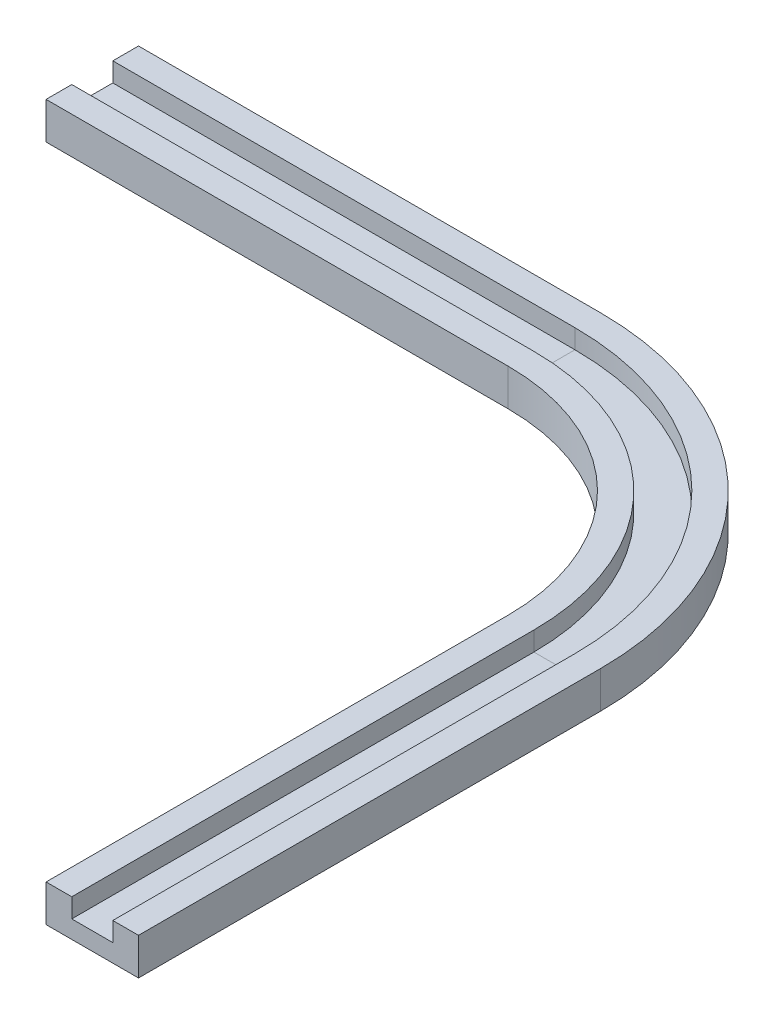
ISO-10303-21;
HEADER;
FILE_DESCRIPTION(('STEP AP214'),'2;1');
FILE_NAME('part.step','',(''),(''),'','','');
FILE_SCHEMA(('AUTOMOTIVE_DESIGN { 1 0 10303 214 1 1 1 1 }'));
ENDSEC;
DATA;
#1=APPLICATION_CONTEXT('core data for automotive mechanical design processes');
#2=APPLICATION_PROTOCOL_DEFINITION('international standard','automotive_design',2000,#1);
#3=PRODUCT_CONTEXT('',#1,'mechanical');
#4=PRODUCT('Part','Part','',(#3));
#5=PRODUCT_RELATED_PRODUCT_CATEGORY('part','',(#4));
#6=PRODUCT_DEFINITION_FORMATION('','',#4);
#7=PRODUCT_DEFINITION_CONTEXT('part definition',#1,'design');
#8=PRODUCT_DEFINITION('design','',#6,#7);
#9=PRODUCT_DEFINITION_SHAPE('','',#8);
#10=(LENGTH_UNIT() NAMED_UNIT(*) SI_UNIT(.MILLI.,.METRE.));
#11=(NAMED_UNIT(*) PLANE_ANGLE_UNIT() SI_UNIT($,.RADIAN.));
#12=(NAMED_UNIT(*) SI_UNIT($,.STERADIAN.) SOLID_ANGLE_UNIT());
#13=UNCERTAINTY_MEASURE_WITH_UNIT(LENGTH_MEASURE(1.E-05),#10,'distance_accuracy_value','');
#14=(GEOMETRIC_REPRESENTATION_CONTEXT(3) GLOBAL_UNCERTAINTY_ASSIGNED_CONTEXT((#13)) GLOBAL_UNIT_ASSIGNED_CONTEXT((#10,
#11,#12)) REPRESENTATION_CONTEXT('',''));
#15=CARTESIAN_POINT('',(0.,0.,0.));
#16=DIRECTION('',(0.,0.,1.));
#17=DIRECTION('',(1.,0.,0.));
#18=AXIS2_PLACEMENT_3D('',#15,#16,#17);
#19=CARTESIAN_POINT('',(-63.1485077421373,8.,-16.7186331560444));
#20=DIRECTION('',(-1.,0.,0.));
#21=DIRECTION('',(0.,0.,1.));
#22=AXIS2_PLACEMENT_3D('',#19,#20,#21);
#23=PLANE('',#22);
#24=DIRECTION('',(0.,0.,1.));
#25=VECTOR('',#24,1.);
#26=CARTESIAN_POINT('',(-63.1485077421373,3.85429480176,-31.1581497267418));
#27=LINE('',#26,#25);
#28=CARTESIAN_POINT('',(-63.1485077421373,3.85429480176,-31.1581497267418));
#29=VERTEX_POINT('',#28);
#30=CARTESIAN_POINT('',(-63.1485077421373,3.85429480176,-22.279116585348));
#31=VERTEX_POINT('',#30);
#32=EDGE_CURVE('E262',#29,#31,#27,.T.);
#33=ORIENTED_EDGE('',*,*,#32,.F.);
#34=DIRECTION('',(0.,-1.,0.));
#35=VECTOR('',#34,1.);
#36=CARTESIAN_POINT('',(-63.1485077421373,8.,-31.1581497267418));
#37=LINE('',#36,#35);
#38=CARTESIAN_POINT('',(-63.1485077421373,8.,-31.1581497267418));
#39=VERTEX_POINT('',#38);
#40=EDGE_CURVE('E266',#39,#29,#37,.T.);
#41=ORIENTED_EDGE('',*,*,#40,.F.);
#42=DIRECTION('',(0.,0.,-1.));
#43=VECTOR('',#42,1.);
#44=CARTESIAN_POINT('',(-63.1485077421373,8.,-16.7186331560444));
#45=LINE('',#44,#43);
#46=CARTESIAN_POINT('',(-63.1485077421373,8.,-36.7186331560443));
#47=VERTEX_POINT('',#46);
#48=EDGE_CURVE('E96',#39,#47,#45,.T.);
#49=ORIENTED_EDGE('',*,*,#48,.T.);
#50=DIRECTION('',(0.,-1.,0.));
#51=VECTOR('',#50,1.);
#52=CARTESIAN_POINT('',(-63.1485077421373,8.,-36.7186331560443));
#53=LINE('',#52,#51);
#54=CARTESIAN_POINT('',(-63.1485077421373,0.,-36.7186331560443));
#55=VERTEX_POINT('',#54);
#56=EDGE_CURVE('E39',#47,#55,#53,.T.);
#57=ORIENTED_EDGE('',*,*,#56,.T.);
#58=DIRECTION('',(0.,0.,-1.));
#59=VECTOR('',#58,1.);
#60=CARTESIAN_POINT('',(-63.1485077421373,0.,-16.7186331560444));
#61=LINE('',#60,#59);
#62=CARTESIAN_POINT('',(-63.1485077421373,0.,-16.7186331560444));
#63=VERTEX_POINT('',#62);
#64=EDGE_CURVE('E149',#63,#55,#61,.T.);
#65=ORIENTED_EDGE('',*,*,#64,.F.);
#66=DIRECTION('',(0.,-1.,0.));
#67=VECTOR('',#66,1.);
#68=CARTESIAN_POINT('',(-63.1485077421373,8.,-16.7186331560444));
#69=LINE('',#68,#67);
#70=CARTESIAN_POINT('',(-63.1485077421373,8.,-16.7186331560444));
#71=VERTEX_POINT('',#70);
#72=EDGE_CURVE('E11',#71,#63,#69,.T.);
#73=ORIENTED_EDGE('',*,*,#72,.F.);
#74=CARTESIAN_POINT('',(-63.1485077421373,8.,-22.279116585348));
#75=VERTEX_POINT('',#74);
#76=EDGE_CURVE('E187',#71,#75,#45,.T.);
#77=ORIENTED_EDGE('',*,*,#76,.T.);
#78=DIRECTION('',(0.,1.,0.));
#79=VECTOR('',#78,1.);
#80=CARTESIAN_POINT('',(-63.1485077421373,8.,-22.279116585348));
#81=LINE('',#80,#79);
#82=EDGE_CURVE('E257',#31,#75,#81,.T.);
#83=ORIENTED_EDGE('',*,*,#82,.F.);
#84=EDGE_LOOP('',(#33,#41,#49,#57,#65,#73,#77,#83));
#85=FACE_BOUND('',#84,.T.);
#86=ADVANCED_FACE('F36',(#85),#23,.T.);
#87=CARTESIAN_POINT('',(103.499598757599,8.,129.929492268602));
#88=DIRECTION('',(0.,0.,1.));
#89=DIRECTION('',(1.,0.,0.));
#90=AXIS2_PLACEMENT_3D('',#87,#88,#89);
#91=PLANE('',#90);
#92=DIRECTION('',(-1.,0.,0.));
#93=VECTOR('',#92,1.);
#94=CARTESIAN_POINT('',(103.499598757599,8.,129.929492268602));
#95=LINE('',#94,#93);
#96=CARTESIAN_POINT('',(103.499598757599,8.,129.929492268602));
#97=VERTEX_POINT('',#96);
#98=CARTESIAN_POINT('',(97.9391153282953,8.,129.929492268602));
#99=VERTEX_POINT('',#98);
#100=EDGE_CURVE('E141',#97,#99,#95,.T.);
#101=ORIENTED_EDGE('',*,*,#100,.T.);
#102=DIRECTION('',(0.,1.,0.));
#103=VECTOR('',#102,1.);
#104=CARTESIAN_POINT('',(97.9391153282953,8.,129.929492268602));
#105=LINE('',#104,#103);
#106=CARTESIAN_POINT('',(97.9391153282953,3.85429480176,129.929492268602));
#107=VERTEX_POINT('',#106);
#108=EDGE_CURVE('E264',#107,#99,#105,.T.);
#109=ORIENTED_EDGE('',*,*,#108,.F.);
#110=DIRECTION('',(1.,0.,0.));
#111=VECTOR('',#110,1.);
#112=CARTESIAN_POINT('',(97.9391153282954,3.85429480176,129.929492268602));
#113=LINE('',#112,#111);
#114=CARTESIAN_POINT('',(89.0600821869015,3.85429480176,129.929492268602));
#115=VERTEX_POINT('',#114);
#116=EDGE_CURVE('E261',#115,#107,#113,.T.);
#117=ORIENTED_EDGE('',*,*,#116,.F.);
#118=DIRECTION('',(0.,-1.,0.));
#119=VECTOR('',#118,1.);
#120=CARTESIAN_POINT('',(89.0600821869015,8.,129.929492268602));
#121=LINE('',#120,#119);
#122=CARTESIAN_POINT('',(89.0600821869015,8.,129.929492268602));
#123=VERTEX_POINT('',#122);
#124=EDGE_CURVE('E153',#123,#115,#121,.T.);
#125=ORIENTED_EDGE('',*,*,#124,.F.);
#126=CARTESIAN_POINT('',(83.4995987575986,8.,129.929492268602));
#127=VERTEX_POINT('',#126);
#128=EDGE_CURVE('E144',#123,#127,#95,.T.);
#129=ORIENTED_EDGE('',*,*,#128,.T.);
#130=DIRECTION('',(0.,-1.,0.));
#131=VECTOR('',#130,1.);
#132=CARTESIAN_POINT('',(83.4995987575986,8.,129.929492268602));
#133=LINE('',#132,#131);
#134=CARTESIAN_POINT('',(83.4995987575986,0.,129.929492268602));
#135=VERTEX_POINT('',#134);
#136=EDGE_CURVE('E138',#127,#135,#133,.T.);
#137=ORIENTED_EDGE('',*,*,#136,.T.);
#138=DIRECTION('',(-1.,0.,0.));
#139=VECTOR('',#138,1.);
#140=CARTESIAN_POINT('',(103.499598757599,0.,129.929492268602));
#141=LINE('',#140,#139);
#142=CARTESIAN_POINT('',(103.499598757599,0.,129.929492268602));
#143=VERTEX_POINT('',#142);
#144=EDGE_CURVE('E162',#143,#135,#141,.T.);
#145=ORIENTED_EDGE('',*,*,#144,.F.);
#146=DIRECTION('',(0.,-1.,0.));
#147=VECTOR('',#146,1.);
#148=CARTESIAN_POINT('',(103.499598757599,8.,129.929492268602));
#149=LINE('',#148,#147);
#150=EDGE_CURVE('E172',#97,#143,#149,.T.);
#151=ORIENTED_EDGE('',*,*,#150,.F.);
#152=EDGE_LOOP('',(#101,#109,#117,#125,#129,#137,#145,#151));
#153=FACE_BOUND('',#152,.T.);
#154=ADVANCED_FACE('F207',(#153),#91,.T.);
#155=CARTESIAN_POINT('',(36.8514922578627,8.,29.9294733436931));
#156=DIRECTION('',(0.,-1.,0.));
#157=DIRECTION('',(0.,0.,-1.));
#158=AXIS2_PLACEMENT_3D('',#155,#156,#157);
#159=PLANE('',#158);
#160=DIRECTION('',(0.,0.,1.));
#161=VECTOR('',#160,1.);
#162=CARTESIAN_POINT('',(97.9391153282954,8.,29.9294894290754));
#163=LINE('',#162,#161);
#164=CARTESIAN_POINT('',(97.9391153282954,8.,29.9294900593818));
#165=VERTEX_POINT('',#164);
#166=EDGE_CURVE('E197',#165,#99,#163,.T.);
#167=ORIENTED_EDGE('',*,*,#166,.T.);
#168=ORIENTED_EDGE('',*,*,#100,.F.);
#169=DIRECTION('',(0.,0.,1.));
#170=VECTOR('',#169,1.);
#171=CARTESIAN_POINT('',(103.499598757599,8.,29.9294922686023));
#172=LINE('',#171,#170);
#173=CARTESIAN_POINT('',(103.499598757599,8.,29.9294922686023));
#174=VERTEX_POINT('',#173);
#175=EDGE_CURVE('E201',#174,#97,#172,.T.);
#176=ORIENTED_EDGE('',*,*,#175,.F.);
#177=CARTESIAN_POINT('',(36.8514922578627,8.,29.9294733436931));
#178=DIRECTION('',(0.,-1.,0.));
#179=DIRECTION('',(0.,0.,-1.));
#180=AXIS2_PLACEMENT_3D('',#177,#178,#179);
#181=CIRCLE('',#180,66.648106499738);
#182=CARTESIAN_POINT('',(36.8514922578627,8.,-36.7186331560449));
#183=VERTEX_POINT('',#182);
#184=EDGE_CURVE('E194',#183,#174,#181,.T.);
#185=ORIENTED_EDGE('',*,*,#184,.F.);
#186=DIRECTION('',(1.,0.,0.));
#187=VECTOR('',#186,1.);
#188=CARTESIAN_POINT('',(-63.1485077421373,8.,-36.7186331560443));
#189=LINE('',#188,#187);
#190=EDGE_CURVE('E192',#47,#183,#189,.T.);
#191=ORIENTED_EDGE('',*,*,#190,.F.);
#192=ORIENTED_EDGE('',*,*,#48,.F.);
#193=DIRECTION('',(1.,0.,0.));
#194=VECTOR('',#193,1.);
#195=CARTESIAN_POINT('',(-64.1485077421373,8.,-31.1581497267418));
#196=LINE('',#195,#194);
#197=CARTESIAN_POINT('',(36.8514922578627,8.,-31.1581497267418));
#198=VERTEX_POINT('',#197);
#199=EDGE_CURVE('E274',#39,#198,#196,.T.);
#200=ORIENTED_EDGE('',*,*,#199,.T.);
#201=CARTESIAN_POINT('',(36.8514922578627,8.,29.9294733436931));
#202=DIRECTION('',(0.,-1.,0.));
#203=DIRECTION('',(0.,0.,-1.));
#204=AXIS2_PLACEMENT_3D('',#201,#202,#203);
#205=CIRCLE('',#204,61.087623070435);
#206=EDGE_CURVE('E278',#198,#165,#205,.T.);
#207=ORIENTED_EDGE('',*,*,#206,.T.);
#208=EDGE_LOOP('',(#167,#168,#176,#185,#191,#192,#200,#207));
#209=FACE_BOUND('',#208,.T.);
#210=ADVANCED_FACE('F306',(#209),#159,.F.);
#211=DIRECTION('',(0.,0.,1.));
#212=VECTOR('',#211,1.);
#213=CARTESIAN_POINT('',(89.0600821869016,8.,29.9294894290754));
#214=LINE('',#213,#212);
#215=CARTESIAN_POINT('',(89.0600821869017,8.,29.9294887987691));
#216=VERTEX_POINT('',#215);
#217=EDGE_CURVE('E213',#216,#123,#214,.T.);
#218=ORIENTED_EDGE('',*,*,#217,.F.);
#219=CARTESIAN_POINT('',(36.8514922578627,8.,29.9294733436931));
#220=DIRECTION('',(0.,-1.,0.));
#221=DIRECTION('',(0.,0.,-1.));
#222=AXIS2_PLACEMENT_3D('',#219,#220,#221);
#223=CIRCLE('',#222,52.2085899290412);
#224=CARTESIAN_POINT('',(36.8514922578627,8.,-22.2791165853481));
#225=VERTEX_POINT('',#224);
#226=EDGE_CURVE('E294',#225,#216,#223,.T.);
#227=ORIENTED_EDGE('',*,*,#226,.F.);
#228=DIRECTION('',(1.,0.,0.));
#229=VECTOR('',#228,1.);
#230=CARTESIAN_POINT('',(-64.1485077421373,8.,-22.279116585348));
#231=LINE('',#230,#229);
#232=EDGE_CURVE('E190',#75,#225,#231,.T.);
#233=ORIENTED_EDGE('',*,*,#232,.F.);
#234=ORIENTED_EDGE('',*,*,#76,.F.);
#235=DIRECTION('',(1.,0.,0.));
#236=VECTOR('',#235,1.);
#237=CARTESIAN_POINT('',(-63.1485077421373,8.,-16.7186331560444));
#238=LINE('',#237,#236);
#239=CARTESIAN_POINT('',(36.8514922578627,8.,-16.7186331560444));
#240=VERTEX_POINT('',#239);
#241=EDGE_CURVE('E125',#71,#240,#238,.T.);
#242=ORIENTED_EDGE('',*,*,#241,.T.);
#243=CARTESIAN_POINT('',(36.8514922578627,8.,29.9294733436931));
#244=DIRECTION('',(0.,-1.,0.));
#245=DIRECTION('',(0.,0.,-1.));
#246=AXIS2_PLACEMENT_3D('',#243,#244,#245);
#247=CIRCLE('',#246,46.6481064997376);
#248=CARTESIAN_POINT('',(83.4995987575984,8.,29.9294865895485));
#249=VERTEX_POINT('',#248);
#250=EDGE_CURVE('E116',#240,#249,#247,.T.);
#251=ORIENTED_EDGE('',*,*,#250,.T.);
#252=DIRECTION('',(0.,0.,1.));
#253=VECTOR('',#252,1.);
#254=CARTESIAN_POINT('',(83.4995987575986,8.,29.9294865895485));
#255=LINE('',#254,#253);
#256=EDGE_CURVE('E122',#249,#127,#255,.T.);
#257=ORIENTED_EDGE('',*,*,#256,.T.);
#258=ORIENTED_EDGE('',*,*,#128,.F.);
#259=EDGE_LOOP('',(#218,#227,#233,#234,#242,#251,#257,#258));
#260=FACE_BOUND('',#259,.T.);
#261=ADVANCED_FACE('F119',(#260),#159,.F.);
#262=CARTESIAN_POINT('',(-63.1485077421373,8.,-16.7186331560444));
#263=DIRECTION('',(0.,0.,-1.));
#264=DIRECTION('',(-1.,0.,0.));
#265=AXIS2_PLACEMENT_3D('',#262,#263,#264);
#266=PLANE('',#265);
#267=DIRECTION('',(1.,0.,0.));
#268=VECTOR('',#267,1.);
#269=CARTESIAN_POINT('',(-63.1485077421373,0.,-16.7186331560444));
#270=LINE('',#269,#268);
#271=CARTESIAN_POINT('',(36.8514922578627,0.,-16.7186331560444));
#272=VERTEX_POINT('',#271);
#273=EDGE_CURVE('E168',#63,#272,#270,.T.);
#274=ORIENTED_EDGE('',*,*,#273,.T.);
#275=DIRECTION('',(0.,-1.,0.));
#276=VECTOR('',#275,1.);
#277=CARTESIAN_POINT('',(36.8514922578627,8.,-16.7186331560444));
#278=LINE('',#277,#276);
#279=EDGE_CURVE('E44',#240,#272,#278,.T.);
#280=ORIENTED_EDGE('',*,*,#279,.F.);
#281=ORIENTED_EDGE('',*,*,#241,.F.);
#282=ORIENTED_EDGE('',*,*,#72,.T.);
#283=EDGE_LOOP('',(#274,#280,#281,#282));
#284=FACE_BOUND('',#283,.T.);
#285=ADVANCED_FACE('F185',(#284),#266,.F.);
#286=CARTESIAN_POINT('',(36.8514922578627,8.,29.9294733436931));
#287=DIRECTION('',(0.,-1.,0.));
#288=DIRECTION('',(0.,0.,-1.));
#289=AXIS2_PLACEMENT_3D('',#286,#287,#288);
#290=CYLINDRICAL_SURFACE('',#289,46.6481064997376);
#291=CARTESIAN_POINT('',(36.8514922578627,0.,29.9294733436931));
#292=DIRECTION('',(0.,-1.,0.));
#293=DIRECTION('',(0.,0.,-1.));
#294=AXIS2_PLACEMENT_3D('',#291,#292,#293);
#295=CIRCLE('',#294,46.6481064997376);
#296=CARTESIAN_POINT('',(83.4995987575984,0.,29.9294865895485));
#297=VERTEX_POINT('',#296);
#298=EDGE_CURVE('E134',#272,#297,#295,.T.);
#299=ORIENTED_EDGE('',*,*,#298,.T.);
#300=DIRECTION('',(0.,-1.,0.));
#301=VECTOR('',#300,1.);
#302=CARTESIAN_POINT('',(83.4995987575984,8.,29.9294865895485));
#303=LINE('',#302,#301);
#304=EDGE_CURVE('E131',#249,#297,#303,.T.);
#305=ORIENTED_EDGE('',*,*,#304,.F.);
#306=ORIENTED_EDGE('',*,*,#250,.F.);
#307=ORIENTED_EDGE('',*,*,#279,.T.);
#308=EDGE_LOOP('',(#299,#305,#306,#307));
#309=FACE_BOUND('',#308,.T.);
#310=ADVANCED_FACE('F132',(#309),#290,.F.);
#311=CARTESIAN_POINT('',(83.4995987575986,8.,29.9294865895485));
#312=DIRECTION('',(1.,0.,0.));
#313=DIRECTION('',(0.,0.,-1.));
#314=AXIS2_PLACEMENT_3D('',#311,#312,#313);
#315=PLANE('',#314);
#316=DIRECTION('',(0.,0.,1.));
#317=VECTOR('',#316,1.);
#318=CARTESIAN_POINT('',(83.4995987575986,0.,29.9294865895485));
#319=LINE('',#318,#317);
#320=EDGE_CURVE('E165',#297,#135,#319,.T.);
#321=ORIENTED_EDGE('',*,*,#320,.T.);
#322=ORIENTED_EDGE('',*,*,#136,.F.);
#323=ORIENTED_EDGE('',*,*,#256,.F.);
#324=ORIENTED_EDGE('',*,*,#304,.T.);
#325=EDGE_LOOP('',(#321,#322,#323,#324));
#326=FACE_BOUND('',#325,.T.);
#327=ADVANCED_FACE('F140',(#326),#315,.F.);
#328=CARTESIAN_POINT('',(103.499598757599,8.,29.9294922686023));
#329=DIRECTION('',(1.,0.,0.));
#330=DIRECTION('',(0.,0.,-1.));
#331=AXIS2_PLACEMENT_3D('',#328,#329,#330);
#332=PLANE('',#331);
#333=DIRECTION('',(0.,0.,1.));
#334=VECTOR('',#333,1.);
#335=CARTESIAN_POINT('',(103.499598757599,0.,29.9294922686023));
#336=LINE('',#335,#334);
#337=CARTESIAN_POINT('',(103.499598757599,0.,29.9294922686023));
#338=VERTEX_POINT('',#337);
#339=EDGE_CURVE('E159',#338,#143,#336,.T.);
#340=ORIENTED_EDGE('',*,*,#339,.F.);
#341=DIRECTION('',(0.,-1.,0.));
#342=VECTOR('',#341,1.);
#343=CARTESIAN_POINT('',(103.499598757599,8.,29.9294922686023));
#344=LINE('',#343,#342);
#345=EDGE_CURVE('E174',#174,#338,#344,.T.);
#346=ORIENTED_EDGE('',*,*,#345,.F.);
#347=ORIENTED_EDGE('',*,*,#175,.T.);
#348=ORIENTED_EDGE('',*,*,#150,.T.);
#349=EDGE_LOOP('',(#340,#346,#347,#348));
#350=FACE_BOUND('',#349,.T.);
#351=ADVANCED_FACE('F311',(#350),#332,.T.);
#352=CARTESIAN_POINT('',(36.8514922578627,8.,29.9294733436931));
#353=DIRECTION('',(0.,-1.,0.));
#354=DIRECTION('',(0.,0.,-1.));
#355=AXIS2_PLACEMENT_3D('',#352,#353,#354);
#356=CYLINDRICAL_SURFACE('',#355,66.648106499738);
#357=CARTESIAN_POINT('',(36.8514922578627,0.,29.9294733436931));
#358=DIRECTION('',(0.,-1.,0.));
#359=DIRECTION('',(0.,0.,-1.));
#360=AXIS2_PLACEMENT_3D('',#357,#358,#359);
#361=CIRCLE('',#360,66.648106499738);
#362=CARTESIAN_POINT('',(36.8514922578627,0.,-36.7186331560449));
#363=VERTEX_POINT('',#362);
#364=EDGE_CURVE('E156',#363,#338,#361,.T.);
#365=ORIENTED_EDGE('',*,*,#364,.F.);
#366=DIRECTION('',(0.,-1.,0.));
#367=VECTOR('',#366,1.);
#368=CARTESIAN_POINT('',(36.8514922578627,8.,-36.7186331560449));
#369=LINE('',#368,#367);
#370=EDGE_CURVE('E175',#183,#363,#369,.T.);
#371=ORIENTED_EDGE('',*,*,#370,.F.);
#372=ORIENTED_EDGE('',*,*,#184,.T.);
#373=ORIENTED_EDGE('',*,*,#345,.T.);
#374=EDGE_LOOP('',(#365,#371,#372,#373));
#375=FACE_BOUND('',#374,.T.);
#376=ADVANCED_FACE('F313',(#375),#356,.T.);
#377=CARTESIAN_POINT('',(-63.1485077421373,8.,-36.7186331560443));
#378=DIRECTION('',(0.,0.,-1.));
#379=DIRECTION('',(-1.,0.,0.));
#380=AXIS2_PLACEMENT_3D('',#377,#378,#379);
#381=PLANE('',#380);
#382=DIRECTION('',(1.,0.,0.));
#383=VECTOR('',#382,1.);
#384=CARTESIAN_POINT('',(-63.1485077421373,0.,-36.7186331560443));
#385=LINE('',#384,#383);
#386=EDGE_CURVE('E152',#55,#363,#385,.T.);
#387=ORIENTED_EDGE('',*,*,#386,.F.);
#388=ORIENTED_EDGE('',*,*,#56,.F.);
#389=ORIENTED_EDGE('',*,*,#190,.T.);
#390=ORIENTED_EDGE('',*,*,#370,.T.);
#391=EDGE_LOOP('',(#387,#388,#389,#390));
#392=FACE_BOUND('',#391,.T.);
#393=ADVANCED_FACE('F182',(#392),#381,.T.);
#394=CARTESIAN_POINT('',(36.8514922578627,0.,29.9294733436931));
#395=DIRECTION('',(0.,-1.,0.));
#396=DIRECTION('',(0.,0.,-1.));
#397=AXIS2_PLACEMENT_3D('',#394,#395,#396);
#398=PLANE('',#397);
#399=ORIENTED_EDGE('',*,*,#64,.T.);
#400=ORIENTED_EDGE('',*,*,#386,.T.);
#401=ORIENTED_EDGE('',*,*,#364,.T.);
#402=ORIENTED_EDGE('',*,*,#339,.T.);
#403=ORIENTED_EDGE('',*,*,#144,.T.);
#404=ORIENTED_EDGE('',*,*,#320,.F.);
#405=ORIENTED_EDGE('',*,*,#298,.F.);
#406=ORIENTED_EDGE('',*,*,#273,.F.);
#407=EDGE_LOOP('',(#399,#400,#401,#402,#403,#404,#405,#406));
#408=FACE_BOUND('',#407,.T.);
#409=ADVANCED_FACE('F184',(#408),#398,.T.);
#410=CARTESIAN_POINT('',(97.9391153282954,8.,29.9294894290754));
#411=DIRECTION('',(-1.,0.,0.));
#412=DIRECTION('',(0.,0.,1.));
#413=AXIS2_PLACEMENT_3D('',#410,#411,#412);
#414=PLANE('',#413);
#415=ORIENTED_EDGE('',*,*,#108,.T.);
#416=ORIENTED_EDGE('',*,*,#166,.F.);
#417=DIRECTION('',(0.,-1.,0.));
#418=VECTOR('',#417,1.);
#419=CARTESIAN_POINT('',(97.9391153282953,8.,29.9294906896881));
#420=LINE('',#419,#418);
#421=CARTESIAN_POINT('',(97.9391153282954,3.85429480176,29.9294900593818));
#422=VERTEX_POINT('',#421);
#423=EDGE_CURVE('E275',#165,#422,#420,.T.);
#424=ORIENTED_EDGE('',*,*,#423,.T.);
#425=DIRECTION('',(0.,0.,1.));
#426=VECTOR('',#425,1.);
#427=CARTESIAN_POINT('',(97.9391153282954,3.85429480176,29.9294894290754));
#428=LINE('',#427,#426);
#429=EDGE_CURVE('E299',#422,#107,#428,.T.);
#430=ORIENTED_EDGE('',*,*,#429,.T.);
#431=EDGE_LOOP('',(#415,#416,#424,#430));
#432=FACE_BOUND('',#431,.T.);
#433=ADVANCED_FACE('F330',(#432),#414,.T.);
#434=CARTESIAN_POINT('',(97.9391153282954,3.85429480176,29.9294894290754));
#435=DIRECTION('',(0.,1.,0.));
#436=DIRECTION('',(0.,0.,1.));
#437=AXIS2_PLACEMENT_3D('',#434,#435,#436);
#438=PLANE('',#437);
#439=ORIENTED_EDGE('',*,*,#116,.T.);
#440=ORIENTED_EDGE('',*,*,#429,.F.);
#441=DIRECTION('',(-0.99999999999996,0.,-2.83952689847525E-07));
#442=VECTOR('',#441,1.);
#443=CARTESIAN_POINT('',(97.9391153282953,3.85429480176,29.9294906896881));
#444=LINE('',#443,#442);
#445=CARTESIAN_POINT('',(89.0600821869017,3.85429480176,29.9294887987691));
#446=VERTEX_POINT('',#445);
#447=EDGE_CURVE('E281',#422,#446,#444,.T.);
#448=ORIENTED_EDGE('',*,*,#447,.T.);
#449=DIRECTION('',(0.,0.,1.));
#450=VECTOR('',#449,1.);
#451=CARTESIAN_POINT('',(89.0600821869016,3.85429480176,29.9294894290754));
#452=LINE('',#451,#450);
#453=EDGE_CURVE('E228',#446,#115,#452,.T.);
#454=ORIENTED_EDGE('',*,*,#453,.T.);
#455=EDGE_LOOP('',(#439,#440,#448,#454));
#456=FACE_BOUND('',#455,.T.);
#457=ADVANCED_FACE('F332',(#456),#438,.T.);
#458=CARTESIAN_POINT('',(89.0600821869016,8.,29.9294894290754));
#459=DIRECTION('',(1.,0.,0.));
#460=DIRECTION('',(0.,0.,-1.));
#461=AXIS2_PLACEMENT_3D('',#458,#459,#460);
#462=PLANE('',#461);
#463=ORIENTED_EDGE('',*,*,#124,.T.);
#464=ORIENTED_EDGE('',*,*,#453,.F.);
#465=DIRECTION('',(0.,1.,0.));
#466=VECTOR('',#465,1.);
#467=CARTESIAN_POINT('',(89.0600821869018,8.,29.9294881684627));
#468=LINE('',#467,#466);
#469=EDGE_CURVE('E291',#446,#216,#468,.T.);
#470=ORIENTED_EDGE('',*,*,#469,.T.);
#471=ORIENTED_EDGE('',*,*,#217,.T.);
#472=EDGE_LOOP('',(#463,#464,#470,#471));
#473=FACE_BOUND('',#472,.T.);
#474=ADVANCED_FACE('F336',(#473),#462,.T.);
#475=CARTESIAN_POINT('',(-64.1485077421373,8.,-31.1581497267418));
#476=DIRECTION('',(0.,0.,1.));
#477=DIRECTION('',(1.,0.,0.));
#478=AXIS2_PLACEMENT_3D('',#475,#476,#477);
#479=PLANE('',#478);
#480=ORIENTED_EDGE('',*,*,#40,.T.);
#481=DIRECTION('',(1.,0.,0.));
#482=VECTOR('',#481,1.);
#483=CARTESIAN_POINT('',(-64.1485077421373,3.85429480176,-31.1581497267418));
#484=LINE('',#483,#482);
#485=CARTESIAN_POINT('',(36.8514922578627,3.85429480176,-31.1581497267418));
#486=VERTEX_POINT('',#485);
#487=EDGE_CURVE('E273',#29,#486,#484,.T.);
#488=ORIENTED_EDGE('',*,*,#487,.T.);
#489=DIRECTION('',(0.,-1.,0.));
#490=VECTOR('',#489,1.);
#491=CARTESIAN_POINT('',(36.8514922578627,8.,-31.1581497267419));
#492=LINE('',#491,#490);
#493=EDGE_CURVE('E270',#198,#486,#492,.T.);
#494=ORIENTED_EDGE('',*,*,#493,.F.);
#495=ORIENTED_EDGE('',*,*,#199,.F.);
#496=EDGE_LOOP('',(#480,#488,#494,#495));
#497=FACE_BOUND('',#496,.T.);
#498=ADVANCED_FACE('F322',(#497),#479,.T.);
#499=CARTESIAN_POINT('',(-64.1485077421373,3.85429480176,-31.1581497267418));
#500=DIRECTION('',(0.,1.,0.));
#501=DIRECTION('',(0.,0.,1.));
#502=AXIS2_PLACEMENT_3D('',#499,#500,#501);
#503=PLANE('',#502);
#504=ORIENTED_EDGE('',*,*,#32,.T.);
#505=DIRECTION('',(1.,0.,0.));
#506=VECTOR('',#505,1.);
#507=CARTESIAN_POINT('',(-64.1485077421373,3.85429480176,-22.279116585348));
#508=LINE('',#507,#506);
#509=CARTESIAN_POINT('',(36.8514922578627,3.85429480176,-22.279116585348));
#510=VERTEX_POINT('',#509);
#511=EDGE_CURVE('E259',#31,#510,#508,.T.);
#512=ORIENTED_EDGE('',*,*,#511,.T.);
#513=DIRECTION('',(0.,0.,1.));
#514=VECTOR('',#513,1.);
#515=CARTESIAN_POINT('',(36.8514922578627,3.85429480176,-31.1581497267419));
#516=LINE('',#515,#514);
#517=EDGE_CURVE('E284',#486,#510,#516,.T.);
#518=ORIENTED_EDGE('',*,*,#517,.F.);
#519=ORIENTED_EDGE('',*,*,#487,.F.);
#520=EDGE_LOOP('',(#504,#512,#518,#519));
#521=FACE_BOUND('',#520,.T.);
#522=ADVANCED_FACE('F325',(#521),#503,.T.);
#523=CARTESIAN_POINT('',(-64.1485077421373,8.,-22.279116585348));
#524=DIRECTION('',(0.,0.,-1.));
#525=DIRECTION('',(-1.,0.,0.));
#526=AXIS2_PLACEMENT_3D('',#523,#524,#525);
#527=PLANE('',#526);
#528=ORIENTED_EDGE('',*,*,#82,.T.);
#529=ORIENTED_EDGE('',*,*,#232,.T.);
#530=DIRECTION('',(0.,1.,0.));
#531=VECTOR('',#530,1.);
#532=CARTESIAN_POINT('',(36.8514922578627,8.,-22.279116585348));
#533=LINE('',#532,#531);
#534=EDGE_CURVE('E52',#510,#225,#533,.T.);
#535=ORIENTED_EDGE('',*,*,#534,.F.);
#536=ORIENTED_EDGE('',*,*,#511,.F.);
#537=EDGE_LOOP('',(#528,#529,#535,#536));
#538=FACE_BOUND('',#537,.T.);
#539=ADVANCED_FACE('F258',(#538),#527,.T.);
#540=CARTESIAN_POINT('',(36.8514922578627,8.,29.9294733436931));
#541=DIRECTION('',(0.,-1.,0.));
#542=DIRECTION('',(0.,0.,-1.));
#543=AXIS2_PLACEMENT_3D('',#540,#541,#542);
#544=CYLINDRICAL_SURFACE('',#543,61.087623070435);
#545=CARTESIAN_POINT('',(36.8514922578627,3.85429480176,29.9294733436931));
#546=DIRECTION('',(0.,-1.,0.));
#547=DIRECTION('',(0.,0.,-1.));
#548=AXIS2_PLACEMENT_3D('',#545,#546,#547);
#549=CIRCLE('',#548,61.087623070435);
#550=EDGE_CURVE('E277',#486,#422,#549,.T.);
#551=ORIENTED_EDGE('',*,*,#550,.T.);
#552=ORIENTED_EDGE('',*,*,#423,.F.);
#553=ORIENTED_EDGE('',*,*,#206,.F.);
#554=ORIENTED_EDGE('',*,*,#493,.T.);
#555=EDGE_LOOP('',(#551,#552,#553,#554));
#556=FACE_BOUND('',#555,.T.);
#557=ADVANCED_FACE('F329',(#556),#544,.F.);
#558=CARTESIAN_POINT('',(36.8514922578627,3.85429480176,-31.1581497267419));
#559=DIRECTION('',(0.,1.,0.));
#560=DIRECTION('',(0.,0.,1.));
#561=AXIS2_PLACEMENT_3D('',#558,#559,#560);
#562=PLANE('',#561);
#563=CARTESIAN_POINT('',(36.8514922578627,3.85429480176,29.9294733436931));
#564=DIRECTION('',(0.,-1.,0.));
#565=DIRECTION('',(0.,0.,-1.));
#566=AXIS2_PLACEMENT_3D('',#563,#564,#565);
#567=CIRCLE('',#566,52.2085899290412);
#568=EDGE_CURVE('E288',#510,#446,#567,.T.);
#569=ORIENTED_EDGE('',*,*,#568,.T.);
#570=ORIENTED_EDGE('',*,*,#447,.F.);
#571=ORIENTED_EDGE('',*,*,#550,.F.);
#572=ORIENTED_EDGE('',*,*,#517,.T.);
#573=EDGE_LOOP('',(#569,#570,#571,#572));
#574=FACE_BOUND('',#573,.T.);
#575=ADVANCED_FACE('F333',(#574),#562,.T.);
#576=CARTESIAN_POINT('',(36.8514922578627,8.,29.9294733436931));
#577=DIRECTION('',(0.,-1.,0.));
#578=DIRECTION('',(0.,0.,-1.));
#579=AXIS2_PLACEMENT_3D('',#576,#577,#578);
#580=CYLINDRICAL_SURFACE('',#579,52.2085899290412);
#581=ORIENTED_EDGE('',*,*,#226,.T.);
#582=ORIENTED_EDGE('',*,*,#469,.F.);
#583=ORIENTED_EDGE('',*,*,#568,.F.);
#584=ORIENTED_EDGE('',*,*,#534,.T.);
#585=EDGE_LOOP('',(#581,#582,#583,#584));
#586=FACE_BOUND('',#585,.T.);
#587=ADVANCED_FACE('F335',(#586),#580,.T.);
#588=CLOSED_SHELL('',(#86,#154,#210,#261,#285,#310,#327,#351,#376,#393,#409,#433,#457,#474,#498,
#522,#539,#557,#575,#587));
#589=MANIFOLD_SOLID_BREP('B2',#588);
#590=ADVANCED_BREP_SHAPE_REPRESENTATION('',(#18,#589),#14);
#591=SHAPE_DEFINITION_REPRESENTATION(#9,#590);
ENDSEC;
END-ISO-10303-21;
